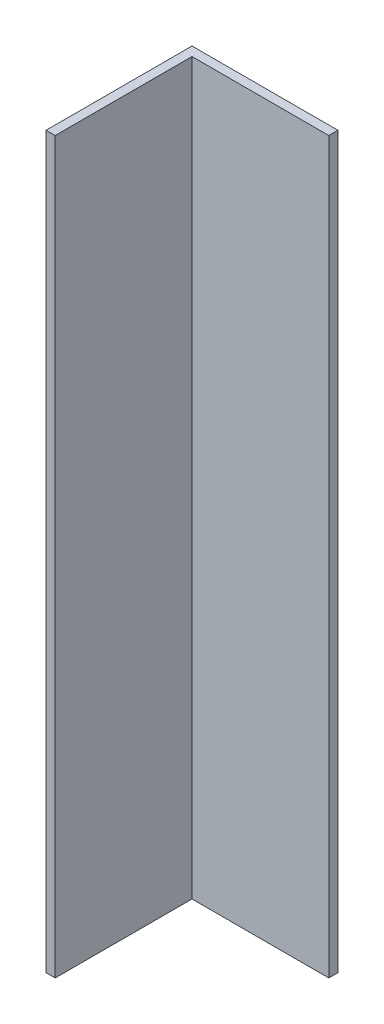
ISO-10303-21;
HEADER;
FILE_DESCRIPTION(('STEP AP214'),'2;1');
FILE_NAME('part.step','',(''),(''),'','','');
FILE_SCHEMA(('AUTOMOTIVE_DESIGN { 1 0 10303 214 1 1 1 1 }'));
ENDSEC;
DATA;
#1=APPLICATION_CONTEXT('core data for automotive mechanical design processes');
#2=APPLICATION_PROTOCOL_DEFINITION('international standard','automotive_design',2000,#1);
#3=PRODUCT_CONTEXT('',#1,'mechanical');
#4=PRODUCT('Part','Part','',(#3));
#5=PRODUCT_RELATED_PRODUCT_CATEGORY('part','',(#4));
#6=PRODUCT_DEFINITION_FORMATION('','',#4);
#7=PRODUCT_DEFINITION_CONTEXT('part definition',#1,'design');
#8=PRODUCT_DEFINITION('design','',#6,#7);
#9=PRODUCT_DEFINITION_SHAPE('','',#8);
#10=(LENGTH_UNIT() NAMED_UNIT(*) SI_UNIT(.MILLI.,.METRE.));
#11=(NAMED_UNIT(*) PLANE_ANGLE_UNIT() SI_UNIT($,.RADIAN.));
#12=(NAMED_UNIT(*) SI_UNIT($,.STERADIAN.) SOLID_ANGLE_UNIT());
#13=UNCERTAINTY_MEASURE_WITH_UNIT(LENGTH_MEASURE(1.E-05),#10,'distance_accuracy_value','');
#14=(GEOMETRIC_REPRESENTATION_CONTEXT(3) GLOBAL_UNCERTAINTY_ASSIGNED_CONTEXT((#13)) GLOBAL_UNIT_ASSIGNED_CONTEXT((#10,
#11,#12)) REPRESENTATION_CONTEXT('',''));
#15=CARTESIAN_POINT('',(0.,0.,0.));
#16=DIRECTION('',(0.,0.,1.));
#17=DIRECTION('',(1.,0.,0.));
#18=AXIS2_PLACEMENT_3D('',#15,#16,#17);
#19=CARTESIAN_POINT('',(0.,127.,0.));
#20=DIRECTION('',(1.,0.,0.));
#21=DIRECTION('',(0.,0.,-1.));
#22=AXIS2_PLACEMENT_3D('',#19,#20,#21);
#23=PLANE('',#22);
#24=DIRECTION('',(0.,0.,1.));
#25=VECTOR('',#24,1.);
#26=CARTESIAN_POINT('',(0.,0.,0.));
#27=LINE('',#26,#25);
#28=CARTESIAN_POINT('',(0.,0.,0.));
#29=VERTEX_POINT('',#28);
#30=CARTESIAN_POINT('',(0.,0.,25.4));
#31=VERTEX_POINT('',#30);
#32=EDGE_CURVE('E119',#29,#31,#27,.T.);
#33=ORIENTED_EDGE('',*,*,#32,.T.);
#34=DIRECTION('',(0.,-1.,0.));
#35=VECTOR('',#34,1.);
#36=CARTESIAN_POINT('',(0.,127.,25.4));
#37=LINE('',#36,#35);
#38=CARTESIAN_POINT('',(0.,127.,25.4));
#39=VERTEX_POINT('',#38);
#40=EDGE_CURVE('E11',#39,#31,#37,.T.);
#41=ORIENTED_EDGE('',*,*,#40,.F.);
#42=DIRECTION('',(0.,0.,1.));
#43=VECTOR('',#42,1.);
#44=CARTESIAN_POINT('',(0.,127.,0.));
#45=LINE('',#44,#43);
#46=CARTESIAN_POINT('',(0.,127.,0.));
#47=VERTEX_POINT('',#46);
#48=EDGE_CURVE('E116',#47,#39,#45,.T.);
#49=ORIENTED_EDGE('',*,*,#48,.F.);
#50=DIRECTION('',(0.,-1.,0.));
#51=VECTOR('',#50,1.);
#52=CARTESIAN_POINT('',(0.,127.,0.));
#53=LINE('',#52,#51);
#54=EDGE_CURVE('E123',#47,#29,#53,.T.);
#55=ORIENTED_EDGE('',*,*,#54,.T.);
#56=EDGE_LOOP('',(#33,#41,#49,#55));
#57=FACE_BOUND('',#56,.T.);
#58=ADVANCED_FACE('F33',(#57),#23,.F.);
#59=CARTESIAN_POINT('',(0.,127.,25.4));
#60=DIRECTION('',(0.,0.,-1.));
#61=DIRECTION('',(-1.,0.,0.));
#62=AXIS2_PLACEMENT_3D('',#59,#60,#61);
#63=PLANE('',#62);
#64=DIRECTION('',(1.,0.,0.));
#65=VECTOR('',#64,1.);
#66=CARTESIAN_POINT('',(0.,0.,25.4));
#67=LINE('',#66,#65);
#68=CARTESIAN_POINT('',(1.5875,0.,25.4));
#69=VERTEX_POINT('',#68);
#70=EDGE_CURVE('E114',#31,#69,#67,.T.);
#71=ORIENTED_EDGE('',*,*,#70,.T.);
#72=DIRECTION('',(0.,1.,0.));
#73=VECTOR('',#72,1.);
#74=CARTESIAN_POINT('',(1.5875,0.,25.4));
#75=LINE('',#74,#73);
#76=CARTESIAN_POINT('',(1.5875,127.,25.4));
#77=VERTEX_POINT('',#76);
#78=EDGE_CURVE('E130',#69,#77,#75,.T.);
#79=ORIENTED_EDGE('',*,*,#78,.T.);
#80=DIRECTION('',(1.,0.,0.));
#81=VECTOR('',#80,1.);
#82=CARTESIAN_POINT('',(0.,127.,25.4));
#83=LINE('',#82,#81);
#84=EDGE_CURVE('E79',#39,#77,#83,.T.);
#85=ORIENTED_EDGE('',*,*,#84,.F.);
#86=ORIENTED_EDGE('',*,*,#40,.T.);
#87=EDGE_LOOP('',(#71,#79,#85,#86));
#88=FACE_BOUND('',#87,.T.);
#89=ADVANCED_FACE('F140',(#88),#63,.F.);
#90=CARTESIAN_POINT('',(25.4,127.,0.));
#91=DIRECTION('',(-1.,0.,0.));
#92=DIRECTION('',(0.,0.,1.));
#93=AXIS2_PLACEMENT_3D('',#90,#91,#92);
#94=PLANE('',#93);
#95=DIRECTION('',(0.,0.,-1.));
#96=VECTOR('',#95,1.);
#97=CARTESIAN_POINT('',(25.4,127.,0.));
#98=LINE('',#97,#96);
#99=CARTESIAN_POINT('',(25.4,127.,1.5875));
#100=VERTEX_POINT('',#99);
#101=CARTESIAN_POINT('',(25.4,127.,0.));
#102=VERTEX_POINT('',#101);
#103=EDGE_CURVE('E110',#100,#102,#98,.T.);
#104=ORIENTED_EDGE('',*,*,#103,.F.);
#105=DIRECTION('',(0.,1.,0.));
#106=VECTOR('',#105,1.);
#107=CARTESIAN_POINT('',(25.4,0.,1.5875));
#108=LINE('',#107,#106);
#109=CARTESIAN_POINT('',(25.4,0.,1.5875));
#110=VERTEX_POINT('',#109);
#111=EDGE_CURVE('E98',#110,#100,#108,.T.);
#112=ORIENTED_EDGE('',*,*,#111,.F.);
#113=DIRECTION('',(0.,0.,-1.));
#114=VECTOR('',#113,1.);
#115=CARTESIAN_POINT('',(25.4,0.,0.));
#116=LINE('',#115,#114);
#117=CARTESIAN_POINT('',(25.4,0.,0.));
#118=VERTEX_POINT('',#117);
#119=EDGE_CURVE('E109',#110,#118,#116,.T.);
#120=ORIENTED_EDGE('',*,*,#119,.T.);
#121=DIRECTION('',(0.,-1.,0.));
#122=VECTOR('',#121,1.);
#123=CARTESIAN_POINT('',(25.4,127.,0.));
#124=LINE('',#123,#122);
#125=EDGE_CURVE('E40',#102,#118,#124,.T.);
#126=ORIENTED_EDGE('',*,*,#125,.F.);
#127=EDGE_LOOP('',(#104,#112,#120,#126));
#128=FACE_BOUND('',#127,.T.);
#129=ADVANCED_FACE('F107',(#128),#94,.F.);
#130=CARTESIAN_POINT('',(0.,127.,0.));
#131=DIRECTION('',(0.,0.,1.));
#132=DIRECTION('',(1.,0.,0.));
#133=AXIS2_PLACEMENT_3D('',#130,#131,#132);
#134=PLANE('',#133);
#135=DIRECTION('',(-1.,0.,0.));
#136=VECTOR('',#135,1.);
#137=CARTESIAN_POINT('',(0.,0.,0.));
#138=LINE('',#137,#136);
#139=EDGE_CURVE('E73',#118,#29,#138,.T.);
#140=ORIENTED_EDGE('',*,*,#139,.T.);
#141=ORIENTED_EDGE('',*,*,#54,.F.);
#142=DIRECTION('',(-1.,0.,0.));
#143=VECTOR('',#142,1.);
#144=CARTESIAN_POINT('',(0.,127.,0.));
#145=LINE('',#144,#143);
#146=EDGE_CURVE('E56',#102,#47,#145,.T.);
#147=ORIENTED_EDGE('',*,*,#146,.F.);
#148=ORIENTED_EDGE('',*,*,#125,.T.);
#149=EDGE_LOOP('',(#140,#141,#147,#148));
#150=FACE_BOUND('',#149,.T.);
#151=ADVANCED_FACE('F124',(#150),#134,.F.);
#152=CARTESIAN_POINT('',(0.,127.,0.));
#153=DIRECTION('',(0.,1.,0.));
#154=DIRECTION('',(0.,0.,1.));
#155=AXIS2_PLACEMENT_3D('',#152,#153,#154);
#156=PLANE('',#155);
#157=DIRECTION('',(0.,0.,1.));
#158=VECTOR('',#157,1.);
#159=CARTESIAN_POINT('',(1.5875,127.,1.5875));
#160=LINE('',#159,#158);
#161=CARTESIAN_POINT('',(1.5875,127.,1.5875));
#162=VERTEX_POINT('',#161);
#163=EDGE_CURVE('E103',#162,#77,#160,.T.);
#164=ORIENTED_EDGE('',*,*,#163,.F.);
#165=DIRECTION('',(-1.,0.,0.));
#166=VECTOR('',#165,1.);
#167=CARTESIAN_POINT('',(25.4,127.,1.5875));
#168=LINE('',#167,#166);
#169=EDGE_CURVE('E142',#100,#162,#168,.T.);
#170=ORIENTED_EDGE('',*,*,#169,.F.);
#171=ORIENTED_EDGE('',*,*,#103,.T.);
#172=ORIENTED_EDGE('',*,*,#146,.T.);
#173=ORIENTED_EDGE('',*,*,#48,.T.);
#174=ORIENTED_EDGE('',*,*,#84,.T.);
#175=EDGE_LOOP('',(#164,#170,#171,#172,#173,#174));
#176=FACE_BOUND('',#175,.T.);
#177=ADVANCED_FACE('F139',(#176),#156,.T.);
#178=CARTESIAN_POINT('',(0.,0.,0.));
#179=DIRECTION('',(0.,1.,0.));
#180=DIRECTION('',(0.,0.,1.));
#181=AXIS2_PLACEMENT_3D('',#178,#179,#180);
#182=PLANE('',#181);
#183=DIRECTION('',(-1.,0.,0.));
#184=VECTOR('',#183,1.);
#185=CARTESIAN_POINT('',(25.4,0.,1.5875));
#186=LINE('',#185,#184);
#187=CARTESIAN_POINT('',(1.5875,0.,1.5875));
#188=VERTEX_POINT('',#187);
#189=EDGE_CURVE('E94',#110,#188,#186,.T.);
#190=ORIENTED_EDGE('',*,*,#189,.T.);
#191=DIRECTION('',(0.,0.,1.));
#192=VECTOR('',#191,1.);
#193=CARTESIAN_POINT('',(1.5875,0.,1.5875));
#194=LINE('',#193,#192);
#195=EDGE_CURVE('E47',#188,#69,#194,.T.);
#196=ORIENTED_EDGE('',*,*,#195,.T.);
#197=ORIENTED_EDGE('',*,*,#70,.F.);
#198=ORIENTED_EDGE('',*,*,#32,.F.);
#199=ORIENTED_EDGE('',*,*,#139,.F.);
#200=ORIENTED_EDGE('',*,*,#119,.F.);
#201=EDGE_LOOP('',(#190,#196,#197,#198,#199,#200));
#202=FACE_BOUND('',#201,.T.);
#203=ADVANCED_FACE('F112',(#202),#182,.F.);
#204=CARTESIAN_POINT('',(1.5875,0.,1.5875));
#205=DIRECTION('',(-1.,0.,0.));
#206=DIRECTION('',(0.,0.,1.));
#207=AXIS2_PLACEMENT_3D('',#204,#205,#206);
#208=PLANE('',#207);
#209=ORIENTED_EDGE('',*,*,#163,.T.);
#210=ORIENTED_EDGE('',*,*,#78,.F.);
#211=ORIENTED_EDGE('',*,*,#195,.F.);
#212=DIRECTION('',(0.,1.,0.));
#213=VECTOR('',#212,1.);
#214=CARTESIAN_POINT('',(1.5875,0.,1.5875));
#215=LINE('',#214,#213);
#216=EDGE_CURVE('E100',#188,#162,#215,.T.);
#217=ORIENTED_EDGE('',*,*,#216,.T.);
#218=EDGE_LOOP('',(#209,#210,#211,#217));
#219=FACE_BOUND('',#218,.T.);
#220=ADVANCED_FACE('F143',(#219),#208,.F.);
#221=CARTESIAN_POINT('',(25.4,0.,1.5875));
#222=DIRECTION('',(0.,0.,-1.));
#223=DIRECTION('',(-1.,0.,0.));
#224=AXIS2_PLACEMENT_3D('',#221,#222,#223);
#225=PLANE('',#224);
#226=ORIENTED_EDGE('',*,*,#169,.T.);
#227=ORIENTED_EDGE('',*,*,#216,.F.);
#228=ORIENTED_EDGE('',*,*,#189,.F.);
#229=ORIENTED_EDGE('',*,*,#111,.T.);
#230=EDGE_LOOP('',(#226,#227,#228,#229));
#231=FACE_BOUND('',#230,.T.);
#232=ADVANCED_FACE('F97',(#231),#225,.F.);
#233=CLOSED_SHELL('',(#58,#89,#129,#151,#177,#203,#220,#232));
#234=MANIFOLD_SOLID_BREP('B2',#233);
#235=ADVANCED_BREP_SHAPE_REPRESENTATION('',(#18,#234),#14);
#236=SHAPE_DEFINITION_REPRESENTATION(#9,#235);
ENDSEC;
END-ISO-10303-21;
